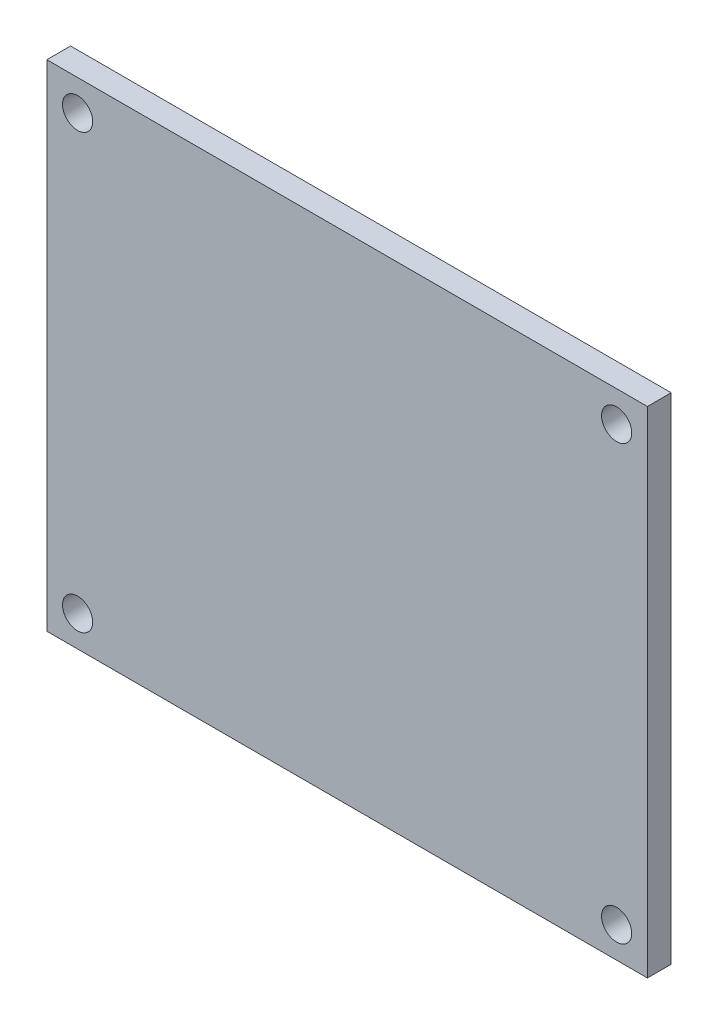
ISO-10303-21;
HEADER;
FILE_DESCRIPTION(('STEP AP214'),'2;1');
FILE_NAME('part.step','',(''),(''),'','','');
FILE_SCHEMA(('AUTOMOTIVE_DESIGN { 1 0 10303 214 1 1 1 1 }'));
ENDSEC;
DATA;
#1=APPLICATION_CONTEXT('core data for automotive mechanical design processes');
#2=APPLICATION_PROTOCOL_DEFINITION('international standard','automotive_design',2000,#1);
#3=PRODUCT_CONTEXT('',#1,'mechanical');
#4=PRODUCT('Part','Part','',(#3));
#5=PRODUCT_RELATED_PRODUCT_CATEGORY('part','',(#4));
#6=PRODUCT_DEFINITION_FORMATION('','',#4);
#7=PRODUCT_DEFINITION_CONTEXT('part definition',#1,'design');
#8=PRODUCT_DEFINITION('design','',#6,#7);
#9=PRODUCT_DEFINITION_SHAPE('','',#8);
#10=(LENGTH_UNIT() NAMED_UNIT(*) SI_UNIT(.MILLI.,.METRE.));
#11=(NAMED_UNIT(*) PLANE_ANGLE_UNIT() SI_UNIT($,.RADIAN.));
#12=(NAMED_UNIT(*) SI_UNIT($,.STERADIAN.) SOLID_ANGLE_UNIT());
#13=UNCERTAINTY_MEASURE_WITH_UNIT(LENGTH_MEASURE(1.E-05),#10,'distance_accuracy_value','');
#14=(GEOMETRIC_REPRESENTATION_CONTEXT(3) GLOBAL_UNCERTAINTY_ASSIGNED_CONTEXT((#13)) GLOBAL_UNIT_ASSIGNED_CONTEXT((#10,
#11,#12)) REPRESENTATION_CONTEXT('',''));
#15=CARTESIAN_POINT('',(0.,0.,0.));
#16=DIRECTION('',(0.,0.,1.));
#17=DIRECTION('',(1.,0.,0.));
#18=AXIS2_PLACEMENT_3D('',#15,#16,#17);
#19=CARTESIAN_POINT('',(0.,41.66,2.));
#20=DIRECTION('',(0.,1.,0.));
#21=DIRECTION('',(0.,0.,1.));
#22=AXIS2_PLACEMENT_3D('',#19,#20,#21);
#23=PLANE('',#22);
#24=DIRECTION('',(1.,0.,0.));
#25=VECTOR('',#24,1.);
#26=CARTESIAN_POINT('',(0.,41.66,0.));
#27=LINE('',#26,#25);
#28=CARTESIAN_POINT('',(-50.55,41.66,0.));
#29=VERTEX_POINT('',#28);
#30=CARTESIAN_POINT('',(0.,41.66,0.));
#31=VERTEX_POINT('',#30);
#32=EDGE_CURVE('E96',#29,#31,#27,.T.);
#33=ORIENTED_EDGE('',*,*,#32,.F.);
#34=DIRECTION('',(0.,0.,-1.));
#35=VECTOR('',#34,1.);
#36=CARTESIAN_POINT('',(-50.55,41.66,2.));
#37=LINE('',#36,#35);
#38=CARTESIAN_POINT('',(-50.55,41.66,2.));
#39=VERTEX_POINT('',#38);
#40=EDGE_CURVE('E11',#39,#29,#37,.T.);
#41=ORIENTED_EDGE('',*,*,#40,.F.);
#42=DIRECTION('',(1.,0.,0.));
#43=VECTOR('',#42,1.);
#44=CARTESIAN_POINT('',(0.,41.66,2.));
#45=LINE('',#44,#43);
#46=CARTESIAN_POINT('',(0.,41.66,2.));
#47=VERTEX_POINT('',#46);
#48=EDGE_CURVE('E89',#39,#47,#45,.T.);
#49=ORIENTED_EDGE('',*,*,#48,.T.);
#50=DIRECTION('',(0.,0.,-1.));
#51=VECTOR('',#50,1.);
#52=CARTESIAN_POINT('',(0.,41.66,2.));
#53=LINE('',#52,#51);
#54=EDGE_CURVE('E71',#47,#31,#53,.T.);
#55=ORIENTED_EDGE('',*,*,#54,.T.);
#56=EDGE_LOOP('',(#33,#41,#49,#55));
#57=FACE_BOUND('',#56,.T.);
#58=ADVANCED_FACE('F33',(#57),#23,.T.);
#59=CARTESIAN_POINT('',(-50.55,0.,2.));
#60=DIRECTION('',(-1.,0.,0.));
#61=DIRECTION('',(0.,0.,1.));
#62=AXIS2_PLACEMENT_3D('',#59,#60,#61);
#63=PLANE('',#62);
#64=DIRECTION('',(0.,1.,0.));
#65=VECTOR('',#64,1.);
#66=CARTESIAN_POINT('',(-50.55,0.,0.));
#67=LINE('',#66,#65);
#68=CARTESIAN_POINT('',(-50.55,0.,0.));
#69=VERTEX_POINT('',#68);
#70=EDGE_CURVE('E82',#69,#29,#67,.T.);
#71=ORIENTED_EDGE('',*,*,#70,.F.);
#72=DIRECTION('',(0.,0.,-1.));
#73=VECTOR('',#72,1.);
#74=CARTESIAN_POINT('',(-50.55,0.,2.));
#75=LINE('',#74,#73);
#76=CARTESIAN_POINT('',(-50.55,0.,2.));
#77=VERTEX_POINT('',#76);
#78=EDGE_CURVE('E41',#77,#69,#75,.T.);
#79=ORIENTED_EDGE('',*,*,#78,.F.);
#80=DIRECTION('',(0.,1.,0.));
#81=VECTOR('',#80,1.);
#82=CARTESIAN_POINT('',(-50.55,0.,2.));
#83=LINE('',#82,#81);
#84=EDGE_CURVE('E80',#77,#39,#83,.T.);
#85=ORIENTED_EDGE('',*,*,#84,.T.);
#86=ORIENTED_EDGE('',*,*,#40,.T.);
#87=EDGE_LOOP('',(#71,#79,#85,#86));
#88=FACE_BOUND('',#87,.T.);
#89=ADVANCED_FACE('F79',(#88),#63,.T.);
#90=CARTESIAN_POINT('',(0.,0.,2.));
#91=DIRECTION('',(0.,-1.,0.));
#92=DIRECTION('',(0.,0.,-1.));
#93=AXIS2_PLACEMENT_3D('',#90,#91,#92);
#94=PLANE('',#93);
#95=DIRECTION('',(-1.,0.,0.));
#96=VECTOR('',#95,1.);
#97=CARTESIAN_POINT('',(0.,0.,0.));
#98=LINE('',#97,#96);
#99=CARTESIAN_POINT('',(0.,0.,0.));
#100=VERTEX_POINT('',#99);
#101=EDGE_CURVE('E101',#100,#69,#98,.T.);
#102=ORIENTED_EDGE('',*,*,#101,.F.);
#103=DIRECTION('',(0.,0.,-1.));
#104=VECTOR('',#103,1.);
#105=CARTESIAN_POINT('',(0.,0.,2.));
#106=LINE('',#105,#104);
#107=CARTESIAN_POINT('',(0.,0.,2.));
#108=VERTEX_POINT('',#107);
#109=EDGE_CURVE('E64',#108,#100,#106,.T.);
#110=ORIENTED_EDGE('',*,*,#109,.F.);
#111=DIRECTION('',(-1.,0.,0.));
#112=VECTOR('',#111,1.);
#113=CARTESIAN_POINT('',(0.,0.,2.));
#114=LINE('',#113,#112);
#115=EDGE_CURVE('E88',#108,#77,#114,.T.);
#116=ORIENTED_EDGE('',*,*,#115,.T.);
#117=ORIENTED_EDGE('',*,*,#78,.T.);
#118=EDGE_LOOP('',(#102,#110,#116,#117));
#119=FACE_BOUND('',#118,.T.);
#120=ADVANCED_FACE('F91',(#119),#94,.T.);
#121=CARTESIAN_POINT('',(0.,0.,2.));
#122=DIRECTION('',(-1.,0.,0.));
#123=DIRECTION('',(0.,0.,1.));
#124=AXIS2_PLACEMENT_3D('',#121,#122,#123);
#125=PLANE('',#124);
#126=DIRECTION('',(0.,1.,0.));
#127=VECTOR('',#126,1.);
#128=CARTESIAN_POINT('',(0.,0.,0.));
#129=LINE('',#128,#127);
#130=EDGE_CURVE('E103',#100,#31,#129,.T.);
#131=ORIENTED_EDGE('',*,*,#130,.T.);
#132=ORIENTED_EDGE('',*,*,#54,.F.);
#133=DIRECTION('',(0.,1.,0.));
#134=VECTOR('',#133,1.);
#135=CARTESIAN_POINT('',(0.,0.,2.));
#136=LINE('',#135,#134);
#137=EDGE_CURVE('E49',#108,#47,#136,.T.);
#138=ORIENTED_EDGE('',*,*,#137,.F.);
#139=ORIENTED_EDGE('',*,*,#109,.T.);
#140=EDGE_LOOP('',(#131,#132,#138,#139));
#141=FACE_BOUND('',#140,.T.);
#142=ADVANCED_FACE('F148',(#141),#125,.F.);
#143=CARTESIAN_POINT('',(0.,0.,2.));
#144=DIRECTION('',(0.,0.,1.));
#145=DIRECTION('',(1.,0.,0.));
#146=AXIS2_PLACEMENT_3D('',#143,#144,#145);
#147=PLANE('',#146);
#148=CARTESIAN_POINT('',(-47.96,2.59,2.));
#149=DIRECTION('',(0.,0.,-1.));
#150=DIRECTION('',(-1.,0.,0.));
#151=AXIS2_PLACEMENT_3D('',#148,#149,#150);
#152=CIRCLE('',#151,1.27);
#153=CARTESIAN_POINT('',(-49.23,2.59,2.));
#154=VERTEX_POINT('',#153);
#155=EDGE_CURVE('E120',#154,#154,#152,.T.);
#156=ORIENTED_EDGE('',*,*,#155,.T.);
#157=EDGE_LOOP('',(#156));
#158=FACE_BOUND('',#157,.T.);
#159=CARTESIAN_POINT('',(-2.59,39.07,2.));
#160=DIRECTION('',(0.,0.,-1.));
#161=DIRECTION('',(-1.,0.,0.));
#162=AXIS2_PLACEMENT_3D('',#159,#160,#161);
#163=CIRCLE('',#162,1.27);
#164=CARTESIAN_POINT('',(-3.86,39.07,2.));
#165=VERTEX_POINT('',#164);
#166=EDGE_CURVE('E113',#165,#165,#163,.T.);
#167=ORIENTED_EDGE('',*,*,#166,.T.);
#168=EDGE_LOOP('',(#167));
#169=FACE_BOUND('',#168,.T.);
#170=CARTESIAN_POINT('',(-2.59,2.59,2.));
#171=DIRECTION('',(0.,0.,-1.));
#172=DIRECTION('',(-1.,0.,0.));
#173=AXIS2_PLACEMENT_3D('',#170,#171,#172);
#174=CIRCLE('',#173,1.27);
#175=CARTESIAN_POINT('',(-3.86,2.59,2.));
#176=VERTEX_POINT('',#175);
#177=EDGE_CURVE('E125',#176,#176,#174,.T.);
#178=ORIENTED_EDGE('',*,*,#177,.T.);
#179=EDGE_LOOP('',(#178));
#180=FACE_BOUND('',#179,.T.);
#181=CARTESIAN_POINT('',(-47.96,39.07,2.));
#182=DIRECTION('',(0.,0.,-1.));
#183=DIRECTION('',(-1.,0.,0.));
#184=AXIS2_PLACEMENT_3D('',#181,#182,#183);
#185=CIRCLE('',#184,1.26999999999999);
#186=CARTESIAN_POINT('',(-49.23,39.07,2.));
#187=VERTEX_POINT('',#186);
#188=EDGE_CURVE('E99',#187,#187,#185,.T.);
#189=ORIENTED_EDGE('',*,*,#188,.T.);
#190=EDGE_LOOP('',(#189));
#191=FACE_BOUND('',#190,.T.);
#192=ORIENTED_EDGE('',*,*,#48,.F.);
#193=ORIENTED_EDGE('',*,*,#84,.F.);
#194=ORIENTED_EDGE('',*,*,#115,.F.);
#195=ORIENTED_EDGE('',*,*,#137,.T.);
#196=EDGE_LOOP('',(#192,#193,#194,#195));
#197=FACE_BOUND('',#196,.T.);
#198=ADVANCED_FACE('F87',(#158,#169,#180,#191,#197),#147,.T.);
#199=CARTESIAN_POINT('',(0.,0.,0.));
#200=DIRECTION('',(0.,0.,1.));
#201=DIRECTION('',(1.,0.,0.));
#202=AXIS2_PLACEMENT_3D('',#199,#200,#201);
#203=PLANE('',#202);
#204=CARTESIAN_POINT('',(-47.96,2.59,0.));
#205=DIRECTION('',(0.,0.,-1.));
#206=DIRECTION('',(-1.,0.,0.));
#207=AXIS2_PLACEMENT_3D('',#204,#205,#206);
#208=CIRCLE('',#207,1.27);
#209=CARTESIAN_POINT('',(-49.23,2.59,0.));
#210=VERTEX_POINT('',#209);
#211=EDGE_CURVE('E110',#210,#210,#208,.T.);
#212=ORIENTED_EDGE('',*,*,#211,.F.);
#213=EDGE_LOOP('',(#212));
#214=FACE_BOUND('',#213,.T.);
#215=CARTESIAN_POINT('',(-2.59,39.07,0.));
#216=DIRECTION('',(0.,0.,-1.));
#217=DIRECTION('',(-1.,0.,0.));
#218=AXIS2_PLACEMENT_3D('',#215,#216,#217);
#219=CIRCLE('',#218,1.27);
#220=CARTESIAN_POINT('',(-3.86,39.07,0.));
#221=VERTEX_POINT('',#220);
#222=EDGE_CURVE('E116',#221,#221,#219,.T.);
#223=ORIENTED_EDGE('',*,*,#222,.F.);
#224=EDGE_LOOP('',(#223));
#225=FACE_BOUND('',#224,.T.);
#226=CARTESIAN_POINT('',(-2.59,2.59,0.));
#227=DIRECTION('',(0.,0.,-1.));
#228=DIRECTION('',(-1.,0.,0.));
#229=AXIS2_PLACEMENT_3D('',#226,#227,#228);
#230=CIRCLE('',#229,1.27);
#231=CARTESIAN_POINT('',(-3.86,2.59,0.));
#232=VERTEX_POINT('',#231);
#233=EDGE_CURVE('E117',#232,#232,#230,.T.);
#234=ORIENTED_EDGE('',*,*,#233,.F.);
#235=EDGE_LOOP('',(#234));
#236=FACE_BOUND('',#235,.T.);
#237=CARTESIAN_POINT('',(-47.96,39.07,0.));
#238=DIRECTION('',(0.,0.,-1.));
#239=DIRECTION('',(-1.,0.,0.));
#240=AXIS2_PLACEMENT_3D('',#237,#238,#239);
#241=CIRCLE('',#240,1.26999999999999);
#242=CARTESIAN_POINT('',(-49.23,39.07,0.));
#243=VERTEX_POINT('',#242);
#244=EDGE_CURVE('E107',#243,#243,#241,.T.);
#245=ORIENTED_EDGE('',*,*,#244,.F.);
#246=EDGE_LOOP('',(#245));
#247=FACE_BOUND('',#246,.T.);
#248=ORIENTED_EDGE('',*,*,#32,.T.);
#249=ORIENTED_EDGE('',*,*,#130,.F.);
#250=ORIENTED_EDGE('',*,*,#101,.T.);
#251=ORIENTED_EDGE('',*,*,#70,.T.);
#252=EDGE_LOOP('',(#248,#249,#250,#251));
#253=FACE_BOUND('',#252,.T.);
#254=ADVANCED_FACE('F133',(#214,#225,#236,#247,#253),#203,.F.);
#255=CARTESIAN_POINT('',(-47.96,39.07,2.));
#256=DIRECTION('',(0.,0.,-1.));
#257=DIRECTION('',(-1.,0.,0.));
#258=AXIS2_PLACEMENT_3D('',#255,#256,#257);
#259=CYLINDRICAL_SURFACE('',#258,1.26999999999999);
#260=ORIENTED_EDGE('',*,*,#188,.F.);
#261=EDGE_LOOP('',(#260));
#262=FACE_BOUND('',#261,.T.);
#263=ORIENTED_EDGE('',*,*,#244,.T.);
#264=EDGE_LOOP('',(#263));
#265=FACE_BOUND('',#264,.T.);
#266=ADVANCED_FACE('F136',(#262,#265),#259,.F.);
#267=CARTESIAN_POINT('',(-2.59,2.59,2.));
#268=DIRECTION('',(0.,0.,-1.));
#269=DIRECTION('',(-1.,0.,0.));
#270=AXIS2_PLACEMENT_3D('',#267,#268,#269);
#271=CYLINDRICAL_SURFACE('',#270,1.27);
#272=ORIENTED_EDGE('',*,*,#177,.F.);
#273=EDGE_LOOP('',(#272));
#274=FACE_BOUND('',#273,.T.);
#275=ORIENTED_EDGE('',*,*,#233,.T.);
#276=EDGE_LOOP('',(#275));
#277=FACE_BOUND('',#276,.T.);
#278=ADVANCED_FACE('F131',(#274,#277),#271,.F.);
#279=CARTESIAN_POINT('',(-2.59,39.07,2.));
#280=DIRECTION('',(0.,0.,-1.));
#281=DIRECTION('',(-1.,0.,0.));
#282=AXIS2_PLACEMENT_3D('',#279,#280,#281);
#283=CYLINDRICAL_SURFACE('',#282,1.27);
#284=ORIENTED_EDGE('',*,*,#166,.F.);
#285=EDGE_LOOP('',(#284));
#286=FACE_BOUND('',#285,.T.);
#287=ORIENTED_EDGE('',*,*,#222,.T.);
#288=EDGE_LOOP('',(#287));
#289=FACE_BOUND('',#288,.T.);
#290=ADVANCED_FACE('F159',(#286,#289),#283,.F.);
#291=CARTESIAN_POINT('',(-47.96,2.59,2.));
#292=DIRECTION('',(0.,0.,-1.));
#293=DIRECTION('',(-1.,0.,0.));
#294=AXIS2_PLACEMENT_3D('',#291,#292,#293);
#295=CYLINDRICAL_SURFACE('',#294,1.27);
#296=ORIENTED_EDGE('',*,*,#155,.F.);
#297=EDGE_LOOP('',(#296));
#298=FACE_BOUND('',#297,.T.);
#299=ORIENTED_EDGE('',*,*,#211,.T.);
#300=EDGE_LOOP('',(#299));
#301=FACE_BOUND('',#300,.T.);
#302=ADVANCED_FACE('F162',(#298,#301),#295,.F.);
#303=CLOSED_SHELL('',(#58,#89,#120,#142,#198,#254,#266,#278,#290,#302));
#304=MANIFOLD_SOLID_BREP('B2',#303);
#305=ADVANCED_BREP_SHAPE_REPRESENTATION('',(#18,#304),#14);
#306=SHAPE_DEFINITION_REPRESENTATION(#9,#305);
ENDSEC;
END-ISO-10303-21;
